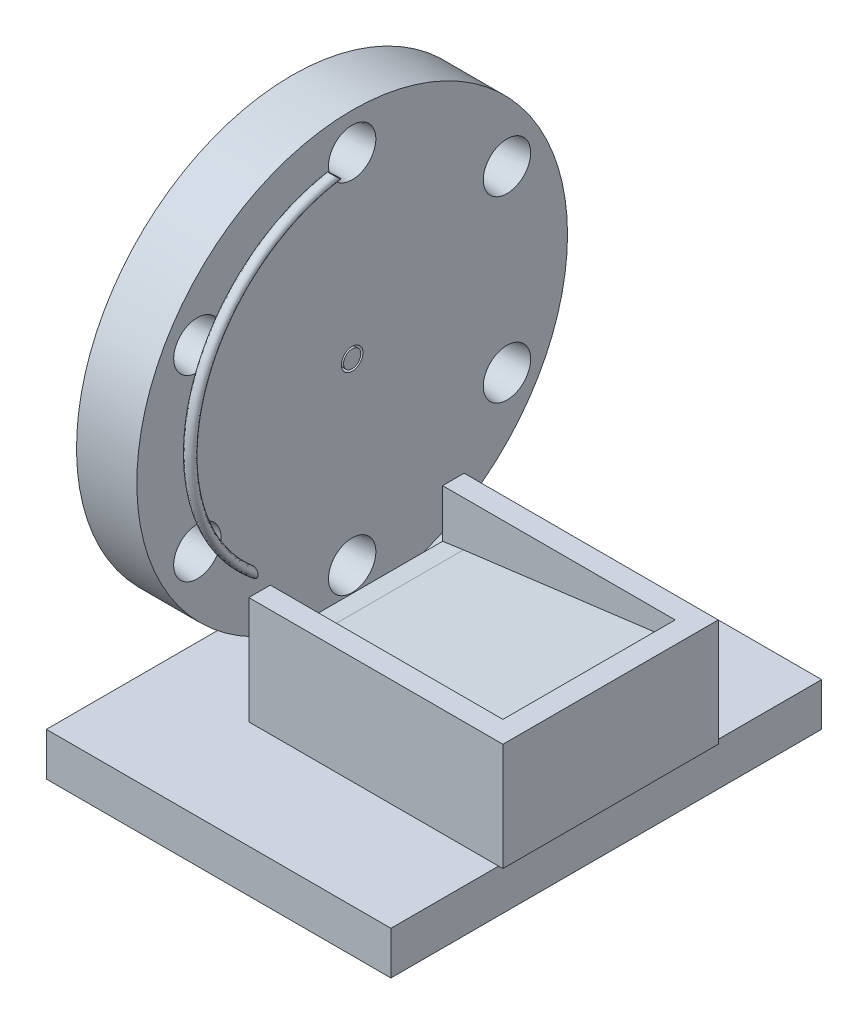
ISO-10303-21;
HEADER;
FILE_DESCRIPTION(('STEP AP214'),'2;1');
FILE_NAME('part.step','',(''),(''),'','','');
FILE_SCHEMA(('AUTOMOTIVE_DESIGN { 1 0 10303 214 1 1 1 1 }'));
ENDSEC;
DATA;
#1=APPLICATION_CONTEXT('core data for automotive mechanical design processes');
#2=APPLICATION_PROTOCOL_DEFINITION('international standard','automotive_design',2000,#1);
#3=PRODUCT_CONTEXT('',#1,'mechanical');
#4=PRODUCT('Part','Part','',(#3));
#5=PRODUCT_RELATED_PRODUCT_CATEGORY('part','',(#4));
#6=PRODUCT_DEFINITION_FORMATION('','',#4);
#7=PRODUCT_DEFINITION_CONTEXT('part definition',#1,'design');
#8=PRODUCT_DEFINITION('design','',#6,#7);
#9=PRODUCT_DEFINITION_SHAPE('','',#8);
#10=(LENGTH_UNIT() NAMED_UNIT(*) SI_UNIT(.MILLI.,.METRE.));
#11=(NAMED_UNIT(*) PLANE_ANGLE_UNIT() SI_UNIT($,.RADIAN.));
#12=(NAMED_UNIT(*) SI_UNIT($,.STERADIAN.) SOLID_ANGLE_UNIT());
#13=UNCERTAINTY_MEASURE_WITH_UNIT(LENGTH_MEASURE(1.E-05),#10,'distance_accuracy_value','');
#14=(GEOMETRIC_REPRESENTATION_CONTEXT(3) GLOBAL_UNCERTAINTY_ASSIGNED_CONTEXT((#13)) GLOBAL_UNIT_ASSIGNED_CONTEXT((#10,
#11,#12)) REPRESENTATION_CONTEXT('',''));
#15=CARTESIAN_POINT('',(0.,0.,0.));
#16=DIRECTION('',(0.,0.,1.));
#17=DIRECTION('',(1.,0.,0.));
#18=AXIS2_PLACEMENT_3D('',#15,#16,#17);
#19=CARTESIAN_POINT('',(-40.,70.,0.));
#20=DIRECTION('',(1.,0.,0.));
#21=DIRECTION('',(0.,0.,-1.));
#22=AXIS2_PLACEMENT_3D('',#19,#20,#21);
#23=CYLINDRICAL_SURFACE('',#22,2.);
#24=CARTESIAN_POINT('',(-40.,70.,0.));
#25=DIRECTION('',(1.,0.,0.));
#26=DIRECTION('',(0.,0.,-1.));
#27=AXIS2_PLACEMENT_3D('',#24,#25,#26);
#28=CIRCLE('',#27,2.);
#29=CARTESIAN_POINT('',(-40.,70.,-2.));
#30=VERTEX_POINT('',#29);
#31=EDGE_CURVE('E11',#30,#30,#28,.T.);
#32=ORIENTED_EDGE('',*,*,#31,.T.);
#33=EDGE_LOOP('',(#32));
#34=FACE_BOUND('',#33,.T.);
#35=CARTESIAN_POINT('',(-19.,70.,0.));
#36=DIRECTION('',(1.,0.,0.));
#37=DIRECTION('',(0.,0.,-1.));
#38=AXIS2_PLACEMENT_3D('',#35,#36,#37);
#39=CIRCLE('',#38,2.);
#40=CARTESIAN_POINT('',(-19.,70.,-2.));
#41=VERTEX_POINT('',#40);
#42=EDGE_CURVE('E42',#41,#41,#39,.T.);
#43=ORIENTED_EDGE('',*,*,#42,.F.);
#44=EDGE_LOOP('',(#43));
#45=FACE_BOUND('',#44,.T.);
#46=ADVANCED_FACE('F39',(#34,#45),#23,.T.);
#47=CARTESIAN_POINT('',(-40.,70.,0.));
#48=DIRECTION('',(1.,0.,0.));
#49=DIRECTION('',(0.,0.,-1.));
#50=AXIS2_PLACEMENT_3D('',#47,#48,#49);
#51=PLANE('',#50);
#52=ORIENTED_EDGE('',*,*,#31,.F.);
#53=EDGE_LOOP('',(#52));
#54=FACE_BOUND('',#53,.T.);
#55=ADVANCED_FACE('F54',(#54),#51,.F.);
#56=CARTESIAN_POINT('',(-19.,70.,0.));
#57=DIRECTION('',(1.,0.,0.));
#58=DIRECTION('',(0.,0.,-1.));
#59=AXIS2_PLACEMENT_3D('',#56,#57,#58);
#60=PLANE('',#59);
#61=ORIENTED_EDGE('',*,*,#42,.T.);
#62=EDGE_LOOP('',(#61));
#63=FACE_BOUND('',#62,.T.);
#64=ADVANCED_FACE('F51',(#63),#60,.T.);
#65=CLOSED_SHELL('',(#46,#55,#64));
#66=MANIFOLD_SOLID_BREP('B2',#65);
#67=CARTESIAN_POINT('',(-19.,70.,0.));
#68=DIRECTION('',(1.,0.,0.));
#69=DIRECTION('',(0.,0.,-1.));
#70=AXIS2_PLACEMENT_3D('',#67,#68,#69);
#71=PLANE('',#70);
#72=CARTESIAN_POINT('',(-19.,28.5,0.));
#73=DIRECTION('',(-1.,0.,0.));
#74=DIRECTION('',(0.,0.,1.));
#75=AXIS2_PLACEMENT_3D('',#72,#73,#74);
#76=CIRCLE('',#75,5.5);
#77=CARTESIAN_POINT('',(-19.,28.5,5.5));
#78=VERTEX_POINT('',#77);
#79=EDGE_CURVE('E106',#78,#78,#76,.T.);
#80=ORIENTED_EDGE('',*,*,#79,.T.);
#81=EDGE_LOOP('',(#80));
#82=FACE_BOUND('',#81,.T.);
#83=CARTESIAN_POINT('',(-19.,70.,0.));
#84=DIRECTION('',(1.,0.,0.));
#85=DIRECTION('',(0.,0.,-1.));
#86=AXIS2_PLACEMENT_3D('',#83,#84,#85);
#87=CIRCLE('',#86,50.);
#88=CARTESIAN_POINT('',(-19.,70.,-50.));
#89=VERTEX_POINT('',#88);
#90=EDGE_CURVE('E144',#89,#89,#87,.T.);
#91=ORIENTED_EDGE('',*,*,#90,.T.);
#92=EDGE_LOOP('',(#91));
#93=FACE_BOUND('',#92,.T.);
#94=CARTESIAN_POINT('',(-19.,70.,0.));
#95=DIRECTION('',(1.,0.,0.));
#96=DIRECTION('',(0.,0.,-1.));
#97=AXIS2_PLACEMENT_3D('',#94,#95,#96);
#98=CIRCLE('',#97,2.5);
#99=CARTESIAN_POINT('',(-19.,70.,-2.5));
#100=VERTEX_POINT('',#99);
#101=EDGE_CURVE('E134',#100,#100,#98,.T.);
#102=ORIENTED_EDGE('',*,*,#101,.F.);
#103=EDGE_LOOP('',(#102));
#104=FACE_BOUND('',#103,.T.);
#105=CARTESIAN_POINT('',(-19.,49.2499999999996,35.940054257054));
#106=DIRECTION('',(-1.,0.,0.));
#107=DIRECTION('',(0.,0.866025403784433,0.50000000000001));
#108=AXIS2_PLACEMENT_3D('',#105,#106,#107);
#109=CIRCLE('',#108,5.5);
#110=CARTESIAN_POINT('',(-19.,54.013139720814,38.690054257054));
#111=VERTEX_POINT('',#110);
#112=EDGE_CURVE('E129',#111,#111,#109,.T.);
#113=ORIENTED_EDGE('',*,*,#112,.T.);
#114=EDGE_LOOP('',(#113));
#115=FACE_BOUND('',#114,.T.);
#116=CARTESIAN_POINT('',(-19.,90.7499999999997,35.9400542570544));
#117=DIRECTION('',(-1.,0.,0.));
#118=DIRECTION('',(0.,0.866025403784443,-0.499999999999992));
#119=AXIS2_PLACEMENT_3D('',#116,#117,#118);
#120=CIRCLE('',#119,5.5);
#121=CARTESIAN_POINT('',(-19.,95.5131397208141,33.1900542570544));
#122=VERTEX_POINT('',#121);
#123=EDGE_CURVE('E124',#122,#122,#120,.T.);
#124=ORIENTED_EDGE('',*,*,#123,.T.);
#125=EDGE_LOOP('',(#124));
#126=FACE_BOUND('',#125,.T.);
#127=CARTESIAN_POINT('',(-19.,111.5,0.));
#128=DIRECTION('',(-1.,0.,0.));
#129=DIRECTION('',(0.,0.,-1.));
#130=AXIS2_PLACEMENT_3D('',#127,#128,#129);
#131=CIRCLE('',#130,5.5);
#132=CARTESIAN_POINT('',(-19.,111.5,-5.5));
#133=VERTEX_POINT('',#132);
#134=EDGE_CURVE('E118',#133,#133,#131,.T.);
#135=ORIENTED_EDGE('',*,*,#134,.T.);
#136=EDGE_LOOP('',(#135));
#137=FACE_BOUND('',#136,.T.);
#138=CARTESIAN_POINT('',(-19.,90.7500000000002,-35.9400542570541));
#139=DIRECTION('',(-1.,0.,0.));
#140=DIRECTION('',(0.,-0.866025403784436,-0.500000000000004));
#141=AXIS2_PLACEMENT_3D('',#138,#139,#140);
#142=CIRCLE('',#141,5.5);
#143=CARTESIAN_POINT('',(-19.,85.9868602791858,-38.6900542570541));
#144=VERTEX_POINT('',#143);
#145=EDGE_CURVE('E112',#144,#144,#142,.T.);
#146=ORIENTED_EDGE('',*,*,#145,.T.);
#147=EDGE_LOOP('',(#146));
#148=FACE_BOUND('',#147,.T.);
#149=CARTESIAN_POINT('',(-19.,49.2500000000001,-35.9400542570542));
#150=DIRECTION('',(-1.,0.,0.));
#151=DIRECTION('',(0.,-0.86602540378444,0.499999999999998));
#152=AXIS2_PLACEMENT_3D('',#149,#150,#151);
#153=CIRCLE('',#152,5.5);
#154=CARTESIAN_POINT('',(-19.,44.4868602791857,-33.1900542570543));
#155=VERTEX_POINT('',#154);
#156=EDGE_CURVE('E108',#155,#155,#153,.T.);
#157=ORIENTED_EDGE('',*,*,#156,.T.);
#158=EDGE_LOOP('',(#157));
#159=FACE_BOUND('',#158,.T.);
#160=ADVANCED_FACE('F89',(#82,#93,#104,#115,#126,#137,#148,#159),#71,.T.);
#161=CARTESIAN_POINT('',(10.,70.,0.));
#162=DIRECTION('',(-1.,0.,0.));
#163=DIRECTION('',(0.,0.,1.));
#164=AXIS2_PLACEMENT_3D('',#161,#162,#163);
#165=CYLINDRICAL_SURFACE('',#164,2.5);
#166=CARTESIAN_POINT('',(-33.,70.,0.));
#167=DIRECTION('',(1.,0.,0.));
#168=DIRECTION('',(0.,1.,0.));
#169=AXIS2_PLACEMENT_3D('',#166,#167,#168);
#170=CIRCLE('',#169,2.5);
#171=CARTESIAN_POINT('',(-33.,72.5,0.));
#172=VERTEX_POINT('',#171);
#173=EDGE_CURVE('E93',#172,#172,#170,.F.);
#174=ORIENTED_EDGE('',*,*,#173,.T.);
#175=EDGE_LOOP('',(#174));
#176=FACE_BOUND('',#175,.T.);
#177=ORIENTED_EDGE('',*,*,#101,.T.);
#178=EDGE_LOOP('',(#177));
#179=FACE_BOUND('',#178,.T.);
#180=ADVANCED_FACE('F91',(#176,#179),#165,.F.);
#181=CARTESIAN_POINT('',(-19.,70.,0.));
#182=DIRECTION('',(-1.,0.,0.));
#183=DIRECTION('',(0.,0.,1.));
#184=AXIS2_PLACEMENT_3D('',#181,#182,#183);
#185=CYLINDRICAL_SURFACE('',#184,50.);
#186=CARTESIAN_POINT('',(-33.,70.,0.));
#187=DIRECTION('',(1.,0.,0.));
#188=DIRECTION('',(0.,1.,0.));
#189=AXIS2_PLACEMENT_3D('',#186,#187,#188);
#190=CIRCLE('',#189,50.);
#191=CARTESIAN_POINT('',(-33.,120.,0.));
#192=VERTEX_POINT('',#191);
#193=EDGE_CURVE('E133',#192,#192,#190,.T.);
#194=ORIENTED_EDGE('',*,*,#193,.T.);
#195=EDGE_LOOP('',(#194));
#196=FACE_BOUND('',#195,.T.);
#197=ORIENTED_EDGE('',*,*,#90,.F.);
#198=EDGE_LOOP('',(#197));
#199=FACE_BOUND('',#198,.T.);
#200=ADVANCED_FACE('F152',(#196,#199),#185,.T.);
#201=CARTESIAN_POINT('',(-31.5,49.2500000000001,-35.9400542570542));
#202=DIRECTION('',(1.,0.,0.));
#203=DIRECTION('',(0.,0.86602540378444,-0.499999999999998));
#204=AXIS2_PLACEMENT_3D('',#201,#202,#203);
#205=CONICAL_SURFACE('',#204,4.,0.119428926018338);
#206=ORIENTED_EDGE('',*,*,#156,.F.);
#207=EDGE_LOOP('',(#206));
#208=FACE_BOUND('',#207,.T.);
#209=CARTESIAN_POINT('',(-31.5,49.2500000000001,-35.9400542570542));
#210=DIRECTION('',(-1.,0.,0.));
#211=DIRECTION('',(0.,-0.86602540378444,0.499999999999998));
#212=AXIS2_PLACEMENT_3D('',#209,#210,#211);
#213=CIRCLE('',#212,4.);
#214=CARTESIAN_POINT('',(-31.5,45.7858983848623,-33.9400542570543));
#215=VERTEX_POINT('',#214);
#216=EDGE_CURVE('E111',#215,#215,#213,.T.);
#217=ORIENTED_EDGE('',*,*,#216,.T.);
#218=EDGE_LOOP('',(#217));
#219=FACE_BOUND('',#218,.T.);
#220=ADVANCED_FACE('F154',(#208,#219),#205,.F.);
#221=CARTESIAN_POINT('',(-31.5,47.2500000000001,-39.404155872192));
#222=DIRECTION('',(-1.,0.,0.));
#223=DIRECTION('',(0.,-0.86602540378444,0.499999999999998));
#224=AXIS2_PLACEMENT_3D('',#221,#222,#223);
#225=PLANE('',#224);
#226=ORIENTED_EDGE('',*,*,#216,.F.);
#227=EDGE_LOOP('',(#226));
#228=FACE_BOUND('',#227,.T.);
#229=ADVANCED_FACE('F161',(#228),#225,.F.);
#230=CARTESIAN_POINT('',(-31.5,90.7500000000002,-35.9400542570541));
#231=DIRECTION('',(1.,0.,0.));
#232=DIRECTION('',(0.,0.866025403784436,0.500000000000004));
#233=AXIS2_PLACEMENT_3D('',#230,#231,#232);
#234=CONICAL_SURFACE('',#233,4.,0.119428926018338);
#235=ORIENTED_EDGE('',*,*,#145,.F.);
#236=EDGE_LOOP('',(#235));
#237=FACE_BOUND('',#236,.T.);
#238=CARTESIAN_POINT('',(-31.5,90.7500000000002,-35.9400542570541));
#239=DIRECTION('',(-1.,0.,0.));
#240=DIRECTION('',(0.,-0.866025403784436,-0.500000000000004));
#241=AXIS2_PLACEMENT_3D('',#238,#239,#240);
#242=CIRCLE('',#241,4.);
#243=CARTESIAN_POINT('',(-31.5,87.2858983848624,-37.9400542570541));
#244=VERTEX_POINT('',#243);
#245=EDGE_CURVE('E115',#244,#244,#242,.T.);
#246=ORIENTED_EDGE('',*,*,#245,.T.);
#247=EDGE_LOOP('',(#246));
#248=FACE_BOUND('',#247,.T.);
#249=ADVANCED_FACE('F181',(#237,#248),#234,.F.);
#250=CARTESIAN_POINT('',(-31.5,92.7500000000002,-39.4041558721919));
#251=DIRECTION('',(-1.,0.,0.));
#252=DIRECTION('',(0.,-0.866025403784436,-0.500000000000004));
#253=AXIS2_PLACEMENT_3D('',#250,#251,#252);
#254=PLANE('',#253);
#255=ORIENTED_EDGE('',*,*,#245,.F.);
#256=EDGE_LOOP('',(#255));
#257=FACE_BOUND('',#256,.T.);
#258=ADVANCED_FACE('F185',(#257),#254,.F.);
#259=CARTESIAN_POINT('',(-31.5,111.5,0.));
#260=DIRECTION('',(1.,0.,0.));
#261=DIRECTION('',(0.,0.,1.));
#262=AXIS2_PLACEMENT_3D('',#259,#260,#261);
#263=CONICAL_SURFACE('',#262,4.,0.119428926018338);
#264=ORIENTED_EDGE('',*,*,#134,.F.);
#265=EDGE_LOOP('',(#264));
#266=FACE_BOUND('',#265,.T.);
#267=CARTESIAN_POINT('',(-31.5,111.5,0.));
#268=DIRECTION('',(-1.,0.,0.));
#269=DIRECTION('',(0.,0.,-1.));
#270=AXIS2_PLACEMENT_3D('',#267,#268,#269);
#271=CIRCLE('',#270,4.);
#272=CARTESIAN_POINT('',(-31.5,111.5,-4.));
#273=VERTEX_POINT('',#272);
#274=EDGE_CURVE('E121',#273,#273,#271,.T.);
#275=ORIENTED_EDGE('',*,*,#274,.T.);
#276=EDGE_LOOP('',(#275));
#277=FACE_BOUND('',#276,.T.);
#278=ADVANCED_FACE('F189',(#266,#277),#263,.F.);
#279=CARTESIAN_POINT('',(-31.5,115.5,0.));
#280=DIRECTION('',(-1.,0.,0.));
#281=DIRECTION('',(0.,0.,-1.));
#282=AXIS2_PLACEMENT_3D('',#279,#280,#281);
#283=PLANE('',#282);
#284=ORIENTED_EDGE('',*,*,#274,.F.);
#285=EDGE_LOOP('',(#284));
#286=FACE_BOUND('',#285,.T.);
#287=ADVANCED_FACE('F193',(#286),#283,.F.);
#288=CARTESIAN_POINT('',(-31.5,90.7499999999997,35.9400542570544));
#289=DIRECTION('',(1.,0.,0.));
#290=DIRECTION('',(0.,-0.866025403784443,0.499999999999992));
#291=AXIS2_PLACEMENT_3D('',#288,#289,#290);
#292=CONICAL_SURFACE('',#291,4.,0.119428926018338);
#293=ORIENTED_EDGE('',*,*,#123,.F.);
#294=EDGE_LOOP('',(#293));
#295=FACE_BOUND('',#294,.T.);
#296=CARTESIAN_POINT('',(-31.5,90.7499999999997,35.9400542570544));
#297=DIRECTION('',(-1.,0.,0.));
#298=DIRECTION('',(0.,0.866025403784443,-0.499999999999992));
#299=AXIS2_PLACEMENT_3D('',#296,#297,#298);
#300=CIRCLE('',#299,4.);
#301=CARTESIAN_POINT('',(-31.5,94.2141016151374,33.9400542570544));
#302=VERTEX_POINT('',#301);
#303=EDGE_CURVE('E102',#302,#302,#300,.T.);
#304=ORIENTED_EDGE('',*,*,#303,.T.);
#305=EDGE_LOOP('',(#304));
#306=FACE_BOUND('',#305,.T.);
#307=ADVANCED_FACE('F197',(#295,#306),#292,.F.);
#308=CARTESIAN_POINT('',(-31.5,92.7499999999996,39.4041558721922));
#309=DIRECTION('',(-1.,0.,0.));
#310=DIRECTION('',(0.,0.866025403784443,-0.499999999999992));
#311=AXIS2_PLACEMENT_3D('',#308,#309,#310);
#312=PLANE('',#311);
#313=ORIENTED_EDGE('',*,*,#303,.F.);
#314=EDGE_LOOP('',(#313));
#315=FACE_BOUND('',#314,.T.);
#316=ADVANCED_FACE('F201',(#315),#312,.F.);
#317=CARTESIAN_POINT('',(-31.5,49.2499999999996,35.940054257054));
#318=DIRECTION('',(1.,0.,0.));
#319=DIRECTION('',(0.,-0.866025403784433,-0.50000000000001));
#320=AXIS2_PLACEMENT_3D('',#317,#318,#319);
#321=CONICAL_SURFACE('',#320,4.,0.119428926018338);
#322=ORIENTED_EDGE('',*,*,#112,.F.);
#323=EDGE_LOOP('',(#322));
#324=FACE_BOUND('',#323,.T.);
#325=CARTESIAN_POINT('',(-31.5,49.2499999999996,35.940054257054));
#326=DIRECTION('',(-1.,0.,0.));
#327=DIRECTION('',(0.,0.866025403784433,0.50000000000001));
#328=AXIS2_PLACEMENT_3D('',#325,#326,#327);
#329=CIRCLE('',#328,4.);
#330=CARTESIAN_POINT('',(-31.5,52.7141016151373,37.940054257054));
#331=VERTEX_POINT('',#330);
#332=EDGE_CURVE('E97',#331,#331,#329,.T.);
#333=ORIENTED_EDGE('',*,*,#332,.T.);
#334=EDGE_LOOP('',(#333));
#335=FACE_BOUND('',#334,.T.);
#336=ADVANCED_FACE('F205',(#324,#335),#321,.F.);
#337=CARTESIAN_POINT('',(-31.5,47.2499999999995,39.4041558721917));
#338=DIRECTION('',(-1.,0.,0.));
#339=DIRECTION('',(0.,0.866025403784433,0.50000000000001));
#340=AXIS2_PLACEMENT_3D('',#337,#338,#339);
#341=PLANE('',#340);
#342=ORIENTED_EDGE('',*,*,#332,.F.);
#343=EDGE_LOOP('',(#342));
#344=FACE_BOUND('',#343,.T.);
#345=ADVANCED_FACE('F176',(#344),#341,.F.);
#346=CARTESIAN_POINT('',(-31.5,24.5,0.));
#347=DIRECTION('',(-1.,0.,0.));
#348=DIRECTION('',(0.,0.,1.));
#349=AXIS2_PLACEMENT_3D('',#346,#347,#348);
#350=PLANE('',#349);
#351=CARTESIAN_POINT('',(-31.5,28.5,0.));
#352=DIRECTION('',(-1.,0.,0.));
#353=DIRECTION('',(0.,0.,1.));
#354=AXIS2_PLACEMENT_3D('',#351,#352,#353);
#355=CIRCLE('',#354,4.);
#356=CARTESIAN_POINT('',(-31.5,28.5,4.));
#357=VERTEX_POINT('',#356);
#358=EDGE_CURVE('E38',#357,#357,#355,.T.);
#359=ORIENTED_EDGE('',*,*,#358,.F.);
#360=EDGE_LOOP('',(#359));
#361=FACE_BOUND('',#360,.T.);
#362=ADVANCED_FACE('F173',(#361),#350,.F.);
#363=CARTESIAN_POINT('',(-31.5,28.5,0.));
#364=DIRECTION('',(1.,0.,0.));
#365=DIRECTION('',(0.,0.,-1.));
#366=AXIS2_PLACEMENT_3D('',#363,#364,#365);
#367=CONICAL_SURFACE('',#366,4.,0.119428926018338);
#368=ORIENTED_EDGE('',*,*,#79,.F.);
#369=EDGE_LOOP('',(#368));
#370=FACE_BOUND('',#369,.T.);
#371=ORIENTED_EDGE('',*,*,#358,.T.);
#372=EDGE_LOOP('',(#371));
#373=FACE_BOUND('',#372,.T.);
#374=ADVANCED_FACE('F169',(#370,#373),#367,.F.);
#375=CARTESIAN_POINT('',(-33.,123.685882858653,-75.));
#376=DIRECTION('',(1.,0.,0.));
#377=DIRECTION('',(0.,1.,0.));
#378=AXIS2_PLACEMENT_3D('',#375,#376,#377);
#379=PLANE('',#378);
#380=ORIENTED_EDGE('',*,*,#193,.F.);
#381=EDGE_LOOP('',(#380));
#382=FACE_BOUND('',#381,.T.);
#383=ORIENTED_EDGE('',*,*,#173,.F.);
#384=EDGE_LOOP('',(#383));
#385=FACE_BOUND('',#384,.T.);
#386=ADVANCED_FACE('F172',(#382,#385),#379,.F.);
#387=CLOSED_SHELL('',(#160,#180,#200,#220,#229,#249,#258,#278,#287,#307,#316,#336,#345,#362,
#374,#386));
#388=MANIFOLD_SOLID_BREP('B6',#387);
#389=CARTESIAN_POINT('',(-16.5,41.2136908193255,25.5746401084224));
#390=DIRECTION('',(0.,0.,1.));
#391=DIRECTION('',(1.,0.,0.));
#392=AXIS2_PLACEMENT_3D('',#389,#390,#391);
#393=PLANE('',#392);
#394=CARTESIAN_POINT('',(-16.5,41.2136908193255,25.5746401084224));
#395=DIRECTION('',(0.,0.,1.));
#396=DIRECTION('',(1.,0.,0.));
#397=AXIS2_PLACEMENT_3D('',#394,#395,#396);
#398=CIRCLE('',#397,1.25);
#399=CARTESIAN_POINT('',(-15.25,41.2136908193255,25.5746401084224));
#400=VERTEX_POINT('',#399);
#401=EDGE_CURVE('E355',#400,#400,#398,.T.);
#402=ORIENTED_EDGE('',*,*,#401,.F.);
#403=EDGE_LOOP('',(#402));
#404=FACE_BOUND('',#403,.T.);
#405=ADVANCED_FACE('F348',(#404),#393,.F.);
#406=CARTESIAN_POINT('',(-16.5,111.46091657168,6.64276366452526));
#407=DIRECTION('',(0.,0.754706316294018,-0.656062783692166));
#408=DIRECTION('',(1.,0.,0.));
#409=AXIS2_PLACEMENT_3D('',#406,#407,#408);
#410=PLANE('',#409);
#411=CARTESIAN_POINT('',(-16.5,111.46091657168,6.64276366452526));
#412=DIRECTION('',(0.,0.754706316294018,-0.656062783692166));
#413=DIRECTION('',(1.,0.,0.));
#414=AXIS2_PLACEMENT_3D('',#411,#412,#413);
#415=CIRCLE('',#414,1.25);
#416=CARTESIAN_POINT('',(-15.25,111.46091657168,6.64276366452526));
#417=VERTEX_POINT('',#416);
#418=EDGE_CURVE('E87',#417,#417,#415,.T.);
#419=ORIENTED_EDGE('',*,*,#418,.T.);
#420=EDGE_LOOP('',(#419));
#421=FACE_BOUND('',#420,.T.);
#422=ADVANCED_FACE('F362',(#421),#410,.T.);
#423=CARTESIAN_POINT('',(-15.25,41.2136908193255,25.5746401084224));
#424=CARTESIAN_POINT('',(-15.25,66.5545905132939,56.225127642911));
#425=CARTESIAN_POINT('',(-15.25,104.9540212264,45.876344897535));
#426=CARTESIAN_POINT('',(-15.25,111.460916571681,6.64276366452528));
#427=CARTESIAN_POINT('',(-15.25,43.7136908193255,25.5746401084224));
#428=CARTESIAN_POINT('',(-15.25,69.0545905132939,53.7380518894193));
#429=CARTESIAN_POINT('',(-15.25,105.190876047431,42.3579012647109));
#430=CARTESIAN_POINT('',(-15.25,109.82075961245,4.75599787379023));
#431=CARTESIAN_POINT('',(-17.75,43.7136908193255,25.5746401084224));
#432=CARTESIAN_POINT('',(-17.75,69.0545905132939,53.7380518894193));
#433=CARTESIAN_POINT('',(-17.75,105.190876047431,42.3579012647109));
#434=CARTESIAN_POINT('',(-17.75,109.82075961245,4.75599787379023));
#435=CARTESIAN_POINT('',(-17.75,41.2136908193255,25.5746401084224));
#436=CARTESIAN_POINT('',(-17.75,66.5545905132939,56.225127642911));
#437=CARTESIAN_POINT('',(-17.75,104.9540212264,45.876344897535));
#438=CARTESIAN_POINT('',(-17.75,111.460916571681,6.64276366452528));
#439=CARTESIAN_POINT('',(-17.75,38.7136908193255,25.5746401084224));
#440=CARTESIAN_POINT('',(-17.75,64.0545905132939,58.7122033964028));
#441=CARTESIAN_POINT('',(-17.75,104.717166405368,49.3947885303592));
#442=CARTESIAN_POINT('',(-17.75,113.101073530911,8.52952945526031));
#443=CARTESIAN_POINT('',(-15.25,38.7136908193255,25.5746401084224));
#444=CARTESIAN_POINT('',(-15.25,64.0545905132939,58.7122033964028));
#445=CARTESIAN_POINT('',(-15.25,104.717166405368,49.3947885303592));
#446=CARTESIAN_POINT('',(-15.25,113.101073530911,8.52952945526031));
#447=CARTESIAN_POINT('',(-15.25,41.2136908193255,25.5746401084224));
#448=CARTESIAN_POINT('',(-15.25,66.5545905132939,56.225127642911));
#449=CARTESIAN_POINT('',(-15.25,104.9540212264,45.876344897535));
#450=CARTESIAN_POINT('',(-15.25,111.460916571681,6.64276366452528));
#451=(BOUNDED_SURFACE() B_SPLINE_SURFACE(3,3,((#423,#424,#425,#426),(#427,#428,#429,#430),(#431,
#432,#433,#434),(#435,#436,#437,#438),(#439,#440,#441,#442),(#443,#444,#445,#446),(#447,#448,
#449,#450)),.UNSPECIFIED.,.T.,.F.,.F.) B_SPLINE_SURFACE_WITH_KNOTS((4,3,4),(4,4),(0.,0.5,1.),
(0.,1.),.UNSPECIFIED.) GEOMETRIC_REPRESENTATION_ITEM() RATIONAL_B_SPLINE_SURFACE(((1.,
0.609793986072294,0.609793986072294,1.),(0.333333333333333,0.203264662024098,0.203264662024098,
0.333333333333333),(0.333333333333333,0.203264662024098,0.203264662024098,0.333333333333333),
(1.,0.609793986072294,0.609793986072294,1.),(0.333333333333333,0.203264662024098,
0.203264662024098,0.333333333333333),(0.333333333333333,0.203264662024098,0.203264662024098,
0.333333333333333),(1.,0.609793986072294,0.609793986072294,1.))) REPRESENTATION_ITEM('') SURFACE());
#452=ORIENTED_EDGE('',*,*,#418,.F.);
#453=EDGE_LOOP('',(#452));
#454=FACE_BOUND('',#453,.T.);
#455=ORIENTED_EDGE('',*,*,#401,.T.);
#456=EDGE_LOOP('',(#455));
#457=FACE_BOUND('',#456,.T.);
#458=ADVANCED_FACE('F364',(#454,#457),#451,.T.);
#459=CLOSED_SHELL('',(#405,#422,#458));
#460=MANIFOLD_SOLID_BREP('B33',#459);
#461=CARTESIAN_POINT('',(-22.6862915010152,70.,0.));
#462=DIRECTION('',(-1.,0.,0.));
#463=DIRECTION('',(0.,0.,1.));
#464=AXIS2_PLACEMENT_3D('',#461,#462,#463);
#465=CYLINDRICAL_SURFACE('',#464,4.);
#466=CARTESIAN_POINT('',(-34.,70.,0.));
#467=DIRECTION('',(-1.,0.,0.));
#468=DIRECTION('',(0.,0.,1.));
#469=AXIS2_PLACEMENT_3D('',#466,#467,#468);
#470=CIRCLE('',#469,4.);
#471=CARTESIAN_POINT('',(-34.,70.,-4.));
#472=VERTEX_POINT('',#471);
#473=CARTESIAN_POINT('',(-34.,70.,4.));
#474=VERTEX_POINT('',#473);
#475=EDGE_CURVE('E591',#472,#474,#470,.F.);
#476=ORIENTED_EDGE('',*,*,#475,.F.);
#477=DIRECTION('',(-1.,0.,0.));
#478=VECTOR('',#477,1.);
#479=CARTESIAN_POINT('',(-40.,70.,-4.));
#480=LINE('',#479,#478);
#481=CARTESIAN_POINT('',(-40.,70.,-4.));
#482=VERTEX_POINT('',#481);
#483=EDGE_CURVE('E597',#472,#482,#480,.T.);
#484=ORIENTED_EDGE('',*,*,#483,.T.);
#485=CARTESIAN_POINT('',(-40.,70.,0.));
#486=DIRECTION('',(-1.,0.,0.));
#487=DIRECTION('',(0.,0.,1.));
#488=AXIS2_PLACEMENT_3D('',#485,#486,#487);
#489=CIRCLE('',#488,4.);
#490=CARTESIAN_POINT('',(-40.,70.,4.));
#491=VERTEX_POINT('',#490);
#492=EDGE_CURVE('E588',#491,#482,#489,.T.);
#493=ORIENTED_EDGE('',*,*,#492,.F.);
#494=DIRECTION('',(1.,0.,0.));
#495=VECTOR('',#494,1.);
#496=CARTESIAN_POINT('',(-40.,70.,4.));
#497=LINE('',#496,#495);
#498=EDGE_CURVE('E594',#491,#474,#497,.T.);
#499=ORIENTED_EDGE('',*,*,#498,.T.);
#500=EDGE_LOOP('',(#476,#484,#493,#499));
#501=FACE_BOUND('',#500,.T.);
#502=ADVANCED_FACE('F397',(#501),#465,.T.);
#503=CARTESIAN_POINT('',(10.,70.,0.));
#504=DIRECTION('',(-1.,0.,0.));
#505=DIRECTION('',(0.,0.,1.));
#506=AXIS2_PLACEMENT_3D('',#503,#504,#505);
#507=CYLINDRICAL_SURFACE('',#506,2.5);
#508=CARTESIAN_POINT('',(-34.,70.,0.));
#509=DIRECTION('',(-1.,0.,0.));
#510=DIRECTION('',(0.,0.,1.));
#511=AXIS2_PLACEMENT_3D('',#508,#509,#510);
#512=CIRCLE('',#511,2.5);
#513=CARTESIAN_POINT('',(-34.,70.,2.5));
#514=VERTEX_POINT('',#513);
#515=EDGE_CURVE('E547',#514,#514,#512,.F.);
#516=ORIENTED_EDGE('',*,*,#515,.T.);
#517=EDGE_LOOP('',(#516));
#518=FACE_BOUND('',#517,.T.);
#519=CARTESIAN_POINT('',(-40.,70.,0.));
#520=DIRECTION('',(-1.,0.,0.));
#521=DIRECTION('',(0.,0.,1.));
#522=AXIS2_PLACEMENT_3D('',#519,#520,#521);
#523=CIRCLE('',#522,2.5);
#524=CARTESIAN_POINT('',(-40.,70.,2.5));
#525=VERTEX_POINT('',#524);
#526=EDGE_CURVE('E585',#525,#525,#523,.T.);
#527=ORIENTED_EDGE('',*,*,#526,.T.);
#528=EDGE_LOOP('',(#527));
#529=FACE_BOUND('',#528,.T.);
#530=ADVANCED_FACE('F739',(#518,#529),#507,.F.);
#531=CARTESIAN_POINT('',(40.,10.,50.));
#532=DIRECTION('',(-1.,0.,0.));
#533=DIRECTION('',(0.,0.,1.));
#534=AXIS2_PLACEMENT_3D('',#531,#532,#533);
#535=PLANE('',#534);
#536=DIRECTION('',(0.,0.,-1.));
#537=VECTOR('',#536,1.);
#538=CARTESIAN_POINT('',(40.,0.,50.));
#539=LINE('',#538,#537);
#540=CARTESIAN_POINT('',(40.,0.,50.));
#541=VERTEX_POINT('',#540);
#542=CARTESIAN_POINT('',(40.,0.,-50.));
#543=VERTEX_POINT('',#542);
#544=EDGE_CURVE('E636',#541,#543,#539,.T.);
#545=ORIENTED_EDGE('',*,*,#544,.T.);
#546=DIRECTION('',(0.,-1.,0.));
#547=VECTOR('',#546,1.);
#548=CARTESIAN_POINT('',(40.,10.,-50.));
#549=LINE('',#548,#547);
#550=CARTESIAN_POINT('',(40.,10.,-50.));
#551=VERTEX_POINT('',#550);
#552=EDGE_CURVE('E642',#551,#543,#549,.T.);
#553=ORIENTED_EDGE('',*,*,#552,.F.);
#554=DIRECTION('',(0.,0.,-1.));
#555=VECTOR('',#554,1.);
#556=CARTESIAN_POINT('',(40.,10.,50.));
#557=LINE('',#556,#555);
#558=CARTESIAN_POINT('',(40.,10.,-25.));
#559=VERTEX_POINT('',#558);
#560=EDGE_CURVE('E624',#559,#551,#557,.T.);
#561=ORIENTED_EDGE('',*,*,#560,.F.);
#562=CARTESIAN_POINT('',(40.,10.,25.));
#563=VERTEX_POINT('',#562);
#564=EDGE_CURVE('E629',#563,#559,#557,.T.);
#565=ORIENTED_EDGE('',*,*,#564,.F.);
#566=CARTESIAN_POINT('',(40.,10.,50.));
#567=VERTEX_POINT('',#566);
#568=EDGE_CURVE('E625',#567,#563,#557,.T.);
#569=ORIENTED_EDGE('',*,*,#568,.F.);
#570=DIRECTION('',(0.,-1.,0.));
#571=VECTOR('',#570,1.);
#572=CARTESIAN_POINT('',(40.,10.,50.));
#573=LINE('',#572,#571);
#574=EDGE_CURVE('E645',#567,#541,#573,.T.);
#575=ORIENTED_EDGE('',*,*,#574,.T.);
#576=EDGE_LOOP('',(#545,#553,#561,#565,#569,#575));
#577=FACE_BOUND('',#576,.T.);
#578=ADVANCED_FACE('F667',(#577),#535,.F.);
#579=CARTESIAN_POINT('',(0.,0.,0.));
#580=DIRECTION('',(0.,1.,0.));
#581=DIRECTION('',(0.,0.,1.));
#582=AXIS2_PLACEMENT_3D('',#579,#580,#581);
#583=PLANE('',#582);
#584=DIRECTION('',(0.,0.,1.));
#585=VECTOR('',#584,1.);
#586=CARTESIAN_POINT('',(-40.,0.,50.));
#587=LINE('',#586,#585);
#588=CARTESIAN_POINT('',(-40.,0.,-50.));
#589=VERTEX_POINT('',#588);
#590=CARTESIAN_POINT('',(-40.,0.,50.));
#591=VERTEX_POINT('',#590);
#592=EDGE_CURVE('E618',#589,#591,#587,.T.);
#593=ORIENTED_EDGE('',*,*,#592,.F.);
#594=DIRECTION('',(-1.,0.,0.));
#595=VECTOR('',#594,1.);
#596=CARTESIAN_POINT('',(40.,0.,-50.));
#597=LINE('',#596,#595);
#598=EDGE_CURVE('E638',#543,#589,#597,.T.);
#599=ORIENTED_EDGE('',*,*,#598,.F.);
#600=ORIENTED_EDGE('',*,*,#544,.F.);
#601=DIRECTION('',(1.,0.,0.));
#602=VECTOR('',#601,1.);
#603=CARTESIAN_POINT('',(40.,0.,50.));
#604=LINE('',#603,#602);
#605=EDGE_CURVE('E634',#591,#541,#604,.T.);
#606=ORIENTED_EDGE('',*,*,#605,.F.);
#607=EDGE_LOOP('',(#593,#599,#600,#606));
#608=FACE_BOUND('',#607,.T.);
#609=ADVANCED_FACE('F663',(#608),#583,.F.);
#610=CARTESIAN_POINT('',(36.,30.8032647421328,69.5686783612047));
#611=DIRECTION('',(0.127162251456478,-0.991881929366857,0.));
#612=DIRECTION('',(0.991881929366857,0.127162251456478,0.));
#613=AXIS2_PLACEMENT_3D('',#610,#611,#612);
#614=PLANE('',#613);
#615=DIRECTION('',(-0.991881929366857,-0.127162251456478,0.));
#616=VECTOR('',#615,1.);
#617=CARTESIAN_POINT('',(36.,30.8032647421328,20.));
#618=LINE('',#617,#616);
#619=CARTESIAN_POINT('',(36.,30.8032647421328,20.));
#620=VERTEX_POINT('',#619);
#621=CARTESIAN_POINT('',(-13.166276329077,24.5,20.));
#622=VERTEX_POINT('',#621);
#623=EDGE_CURVE('E532',#620,#622,#618,.T.);
#624=ORIENTED_EDGE('',*,*,#623,.F.);
#625=DIRECTION('',(0.,0.,-1.));
#626=VECTOR('',#625,1.);
#627=CARTESIAN_POINT('',(36.,30.8032647421328,69.5686783612047));
#628=LINE('',#627,#626);
#629=CARTESIAN_POINT('',(36.,30.8032647421328,-20.));
#630=VERTEX_POINT('',#629);
#631=EDGE_CURVE('E545',#620,#630,#628,.T.);
#632=ORIENTED_EDGE('',*,*,#631,.T.);
#633=DIRECTION('',(-0.991881929366857,-0.127162251456478,0.));
#634=VECTOR('',#633,1.);
#635=CARTESIAN_POINT('',(36.,30.8032647421328,-20.));
#636=LINE('',#635,#634);
#637=CARTESIAN_POINT('',(-13.166276329077,24.5,-20.));
#638=VERTEX_POINT('',#637);
#639=EDGE_CURVE('E533',#630,#638,#636,.T.);
#640=ORIENTED_EDGE('',*,*,#639,.T.);
#641=DIRECTION('',(0.,0.,-1.));
#642=VECTOR('',#641,1.);
#643=CARTESIAN_POINT('',(-13.166276329077,24.5,69.5686783612047));
#644=LINE('',#643,#642);
#645=EDGE_CURVE('E523',#622,#638,#644,.T.);
#646=ORIENTED_EDGE('',*,*,#645,.F.);
#647=EDGE_LOOP('',(#624,#632,#640,#646));
#648=FACE_BOUND('',#647,.T.);
#649=ADVANCED_FACE('F543',(#648),#614,.F.);
#650=CARTESIAN_POINT('',(36.,24.5,-20.));
#651=DIRECTION('',(1.,0.,0.));
#652=DIRECTION('',(0.,0.,-1.));
#653=AXIS2_PLACEMENT_3D('',#650,#651,#652);
#654=PLANE('',#653);
#655=ORIENTED_EDGE('',*,*,#631,.F.);
#656=DIRECTION('',(0.,1.,0.));
#657=VECTOR('',#656,1.);
#658=CARTESIAN_POINT('',(36.,24.5,20.));
#659=LINE('',#658,#657);
#660=CARTESIAN_POINT('',(36.,35.,20.));
#661=VERTEX_POINT('',#660);
#662=EDGE_CURVE('E560',#620,#661,#659,.T.);
#663=ORIENTED_EDGE('',*,*,#662,.T.);
#664=DIRECTION('',(0.,0.,-1.));
#665=VECTOR('',#664,1.);
#666=CARTESIAN_POINT('',(36.,35.,-20.));
#667=LINE('',#666,#665);
#668=CARTESIAN_POINT('',(36.,35.,-20.));
#669=VERTEX_POINT('',#668);
#670=EDGE_CURVE('E555',#661,#669,#667,.T.);
#671=ORIENTED_EDGE('',*,*,#670,.T.);
#672=DIRECTION('',(0.,1.,0.));
#673=VECTOR('',#672,1.);
#674=CARTESIAN_POINT('',(36.,24.5,-20.));
#675=LINE('',#674,#673);
#676=EDGE_CURVE('E561',#630,#669,#675,.T.);
#677=ORIENTED_EDGE('',*,*,#676,.F.);
#678=EDGE_LOOP('',(#655,#663,#671,#677));
#679=FACE_BOUND('',#678,.T.);
#680=ADVANCED_FACE('F722',(#679),#654,.F.);
#681=CARTESIAN_POINT('',(0.,10.,0.));
#682=DIRECTION('',(0.,1.,0.));
#683=DIRECTION('',(0.,0.,1.));
#684=AXIS2_PLACEMENT_3D('',#681,#682,#683);
#685=PLANE('',#684);
#686=DIRECTION('',(1.,0.,0.));
#687=VECTOR('',#686,1.);
#688=CARTESIAN_POINT('',(40.,10.,50.));
#689=LINE('',#688,#687);
#690=CARTESIAN_POINT('',(-40.,10.,50.));
#691=VERTEX_POINT('',#690);
#692=EDGE_CURVE('E621',#691,#567,#689,.T.);
#693=ORIENTED_EDGE('',*,*,#692,.T.);
#694=ORIENTED_EDGE('',*,*,#568,.T.);
#695=DIRECTION('',(1.,0.,0.));
#696=VECTOR('',#695,1.);
#697=CARTESIAN_POINT('',(-19.,10.,25.));
#698=LINE('',#697,#696);
#699=CARTESIAN_POINT('',(-18.,10.,25.));
#700=VERTEX_POINT('',#699);
#701=EDGE_CURVE('E575',#700,#563,#698,.T.);
#702=ORIENTED_EDGE('',*,*,#701,.F.);
#703=DIRECTION('',(0.,0.,1.));
#704=VECTOR('',#703,1.);
#705=CARTESIAN_POINT('',(-18.,10.,-75.));
#706=LINE('',#705,#704);
#707=CARTESIAN_POINT('',(-18.,10.,-25.));
#708=VERTEX_POINT('',#707);
#709=EDGE_CURVE('E711',#708,#700,#706,.T.);
#710=ORIENTED_EDGE('',*,*,#709,.F.);
#711=DIRECTION('',(1.,0.,0.));
#712=VECTOR('',#711,1.);
#713=CARTESIAN_POINT('',(0.,10.,-25.));
#714=LINE('',#713,#712);
#715=EDGE_CURVE('E405',#708,#559,#714,.T.);
#716=ORIENTED_EDGE('',*,*,#715,.T.);
#717=ORIENTED_EDGE('',*,*,#560,.T.);
#718=DIRECTION('',(-1.,0.,0.));
#719=VECTOR('',#718,1.);
#720=CARTESIAN_POINT('',(40.,10.,-50.));
#721=LINE('',#720,#719);
#722=CARTESIAN_POINT('',(-40.,10.,-50.));
#723=VERTEX_POINT('',#722);
#724=EDGE_CURVE('E628',#551,#723,#721,.T.);
#725=ORIENTED_EDGE('',*,*,#724,.T.);
#726=DIRECTION('',(0.,0.,1.));
#727=VECTOR('',#726,1.);
#728=CARTESIAN_POINT('',(-40.,10.,50.));
#729=LINE('',#728,#727);
#730=CARTESIAN_POINT('',(-40.,10.,-4.));
#731=VERTEX_POINT('',#730);
#732=EDGE_CURVE('E619',#723,#731,#729,.T.);
#733=ORIENTED_EDGE('',*,*,#732,.T.);
#734=DIRECTION('',(-1.,0.,0.));
#735=VECTOR('',#734,1.);
#736=CARTESIAN_POINT('',(-40.,10.,-4.));
#737=LINE('',#736,#735);
#738=CARTESIAN_POINT('',(-34.,10.,-4.));
#739=VERTEX_POINT('',#738);
#740=EDGE_CURVE('E598',#739,#731,#737,.T.);
#741=ORIENTED_EDGE('',*,*,#740,.F.);
#742=DIRECTION('',(0.,0.,-1.));
#743=VECTOR('',#742,1.);
#744=CARTESIAN_POINT('',(-34.,10.,-4.));
#745=LINE('',#744,#743);
#746=CARTESIAN_POINT('',(-34.,10.,4.));
#747=VERTEX_POINT('',#746);
#748=EDGE_CURVE('E604',#747,#739,#745,.T.);
#749=ORIENTED_EDGE('',*,*,#748,.F.);
#750=DIRECTION('',(1.,0.,0.));
#751=VECTOR('',#750,1.);
#752=CARTESIAN_POINT('',(-40.,10.,4.));
#753=LINE('',#752,#751);
#754=CARTESIAN_POINT('',(-40.,10.,4.));
#755=VERTEX_POINT('',#754);
#756=EDGE_CURVE('E593',#755,#747,#753,.T.);
#757=ORIENTED_EDGE('',*,*,#756,.F.);
#758=EDGE_CURVE('E622',#755,#691,#729,.T.);
#759=ORIENTED_EDGE('',*,*,#758,.T.);
#760=EDGE_LOOP('',(#693,#694,#702,#710,#716,#717,#725,#733,#741,#749,#757,#759));
#761=FACE_BOUND('',#760,.T.);
#762=ADVANCED_FACE('F673',(#761),#685,.T.);
#763=CARTESIAN_POINT('',(41.,35.,-25.));
#764=DIRECTION('',(-1.,0.,0.));
#765=DIRECTION('',(0.,0.,1.));
#766=AXIS2_PLACEMENT_3D('',#763,#764,#765);
#767=PLANE('',#766);
#768=DIRECTION('',(0.,0.,-1.));
#769=VECTOR('',#768,1.);
#770=CARTESIAN_POINT('',(41.,10.,-25.));
#771=LINE('',#770,#769);
#772=CARTESIAN_POINT('',(41.,10.,25.));
#773=VERTEX_POINT('',#772);
#774=CARTESIAN_POINT('',(41.,10.,-25.));
#775=VERTEX_POINT('',#774);
#776=EDGE_CURVE('E577',#773,#775,#771,.T.);
#777=ORIENTED_EDGE('',*,*,#776,.T.);
#778=DIRECTION('',(0.,-1.,0.));
#779=VECTOR('',#778,1.);
#780=CARTESIAN_POINT('',(41.,35.,-25.));
#781=LINE('',#780,#779);
#782=CARTESIAN_POINT('',(41.,35.,-25.));
#783=VERTEX_POINT('',#782);
#784=EDGE_CURVE('E574',#783,#775,#781,.T.);
#785=ORIENTED_EDGE('',*,*,#784,.F.);
#786=DIRECTION('',(0.,0.,-1.));
#787=VECTOR('',#786,1.);
#788=CARTESIAN_POINT('',(41.,35.,-25.));
#789=LINE('',#788,#787);
#790=CARTESIAN_POINT('',(41.,35.,25.));
#791=VERTEX_POINT('',#790);
#792=EDGE_CURVE('E568',#791,#783,#789,.T.);
#793=ORIENTED_EDGE('',*,*,#792,.F.);
#794=DIRECTION('',(0.,-1.,0.));
#795=VECTOR('',#794,1.);
#796=CARTESIAN_POINT('',(41.,35.,25.));
#797=LINE('',#796,#795);
#798=EDGE_CURVE('E582',#791,#773,#797,.T.);
#799=ORIENTED_EDGE('',*,*,#798,.T.);
#800=EDGE_LOOP('',(#777,#785,#793,#799));
#801=FACE_BOUND('',#800,.T.);
#802=ADVANCED_FACE('F753',(#801),#767,.F.);
#803=CARTESIAN_POINT('',(0.,10.,0.));
#804=DIRECTION('',(0.,1.,0.));
#805=DIRECTION('',(0.,0.,1.));
#806=AXIS2_PLACEMENT_3D('',#803,#804,#805);
#807=PLANE('',#806);
#808=EDGE_CURVE('E563',#563,#773,#698,.T.);
#809=ORIENTED_EDGE('',*,*,#808,.F.);
#810=ORIENTED_EDGE('',*,*,#564,.T.);
#811=DIRECTION('',(-1.,0.,0.));
#812=VECTOR('',#811,1.);
#813=CARTESIAN_POINT('',(-19.,10.,-25.));
#814=LINE('',#813,#812);
#815=EDGE_CURVE('E569',#775,#559,#814,.T.);
#816=ORIENTED_EDGE('',*,*,#815,.F.);
#817=ORIENTED_EDGE('',*,*,#776,.F.);
#818=EDGE_LOOP('',(#809,#810,#816,#817));
#819=FACE_BOUND('',#818,.T.);
#820=ADVANCED_FACE('F680',(#819),#807,.F.);
#821=CARTESIAN_POINT('',(-19.,35.,-25.));
#822=DIRECTION('',(0.,0.,1.));
#823=DIRECTION('',(1.,0.,0.));
#824=AXIS2_PLACEMENT_3D('',#821,#822,#823);
#825=PLANE('',#824);
#826=ORIENTED_EDGE('',*,*,#715,.F.);
#827=DIRECTION('',(0.,1.,0.));
#828=VECTOR('',#827,1.);
#829=CARTESIAN_POINT('',(-18.,35.,-25.));
#830=LINE('',#829,#828);
#831=CARTESIAN_POINT('',(-18.,35.,-25.));
#832=VERTEX_POINT('',#831);
#833=EDGE_CURVE('E701',#708,#832,#830,.T.);
#834=ORIENTED_EDGE('',*,*,#833,.T.);
#835=DIRECTION('',(-1.,0.,0.));
#836=VECTOR('',#835,1.);
#837=CARTESIAN_POINT('',(-19.,35.,-25.));
#838=LINE('',#837,#836);
#839=EDGE_CURVE('E571',#783,#832,#838,.T.);
#840=ORIENTED_EDGE('',*,*,#839,.F.);
#841=ORIENTED_EDGE('',*,*,#784,.T.);
#842=ORIENTED_EDGE('',*,*,#815,.T.);
#843=EDGE_LOOP('',(#826,#834,#840,#841,#842));
#844=FACE_BOUND('',#843,.T.);
#845=ADVANCED_FACE('F865',(#844),#825,.F.);
#846=CARTESIAN_POINT('',(-19.,35.,25.));
#847=DIRECTION('',(0.,0.,-1.));
#848=DIRECTION('',(-1.,0.,0.));
#849=AXIS2_PLACEMENT_3D('',#846,#847,#848);
#850=PLANE('',#849);
#851=DIRECTION('',(1.,0.,0.));
#852=VECTOR('',#851,1.);
#853=CARTESIAN_POINT('',(-19.,35.,25.));
#854=LINE('',#853,#852);
#855=CARTESIAN_POINT('',(-18.,35.,25.));
#856=VERTEX_POINT('',#855);
#857=EDGE_CURVE('E566',#856,#791,#854,.T.);
#858=ORIENTED_EDGE('',*,*,#857,.F.);
#859=DIRECTION('',(0.,-1.,0.));
#860=VECTOR('',#859,1.);
#861=CARTESIAN_POINT('',(-18.,35.,25.));
#862=LINE('',#861,#860);
#863=EDGE_CURVE('E346',#856,#700,#862,.T.);
#864=ORIENTED_EDGE('',*,*,#863,.T.);
#865=ORIENTED_EDGE('',*,*,#701,.T.);
#866=ORIENTED_EDGE('',*,*,#808,.T.);
#867=ORIENTED_EDGE('',*,*,#798,.F.);
#868=EDGE_LOOP('',(#858,#864,#865,#866,#867));
#869=FACE_BOUND('',#868,.T.);
#870=ADVANCED_FACE('F735',(#869),#850,.F.);
#871=CARTESIAN_POINT('',(0.,35.,0.));
#872=DIRECTION('',(0.,1.,0.));
#873=DIRECTION('',(0.,0.,1.));
#874=AXIS2_PLACEMENT_3D('',#871,#872,#873);
#875=PLANE('',#874);
#876=DIRECTION('',(0.,0.,-1.));
#877=VECTOR('',#876,1.);
#878=CARTESIAN_POINT('',(-18.,35.,0.));
#879=LINE('',#878,#877);
#880=CARTESIAN_POINT('',(-18.,35.,20.));
#881=VERTEX_POINT('',#880);
#882=EDGE_CURVE('E707',#856,#881,#879,.T.);
#883=ORIENTED_EDGE('',*,*,#882,.F.);
#884=ORIENTED_EDGE('',*,*,#857,.T.);
#885=ORIENTED_EDGE('',*,*,#792,.T.);
#886=ORIENTED_EDGE('',*,*,#839,.T.);
#887=CARTESIAN_POINT('',(-18.,35.,-20.));
#888=VERTEX_POINT('',#887);
#889=EDGE_CURVE('E703',#888,#832,#879,.T.);
#890=ORIENTED_EDGE('',*,*,#889,.F.);
#891=DIRECTION('',(-1.,0.,0.));
#892=VECTOR('',#891,1.);
#893=CARTESIAN_POINT('',(-19.,35.,-20.));
#894=LINE('',#893,#892);
#895=EDGE_CURVE('E558',#669,#888,#894,.T.);
#896=ORIENTED_EDGE('',*,*,#895,.F.);
#897=ORIENTED_EDGE('',*,*,#670,.F.);
#898=DIRECTION('',(1.,0.,0.));
#899=VECTOR('',#898,1.);
#900=CARTESIAN_POINT('',(-19.,35.,20.));
#901=LINE('',#900,#899);
#902=EDGE_CURVE('E552',#881,#661,#901,.T.);
#903=ORIENTED_EDGE('',*,*,#902,.F.);
#904=EDGE_LOOP('',(#883,#884,#885,#886,#890,#896,#897,#903));
#905=FACE_BOUND('',#904,.T.);
#906=ADVANCED_FACE('F719',(#905),#875,.T.);
#907=CARTESIAN_POINT('',(-19.,24.5,20.));
#908=DIRECTION('',(0.,0.,1.));
#909=DIRECTION('',(1.,0.,0.));
#910=AXIS2_PLACEMENT_3D('',#907,#908,#909);
#911=PLANE('',#910);
#912=ORIENTED_EDGE('',*,*,#623,.T.);
#913=DIRECTION('',(0.990058975735206,0.140652851254978,0.));
#914=VECTOR('',#913,1.);
#915=CARTESIAN_POINT('',(-13.166276329077,24.5,20.));
#916=LINE('',#915,#914);
#917=CARTESIAN_POINT('',(-18.,23.8132964468211,20.));
#918=VERTEX_POINT('',#917);
#919=EDGE_CURVE('E528',#918,#622,#916,.T.);
#920=ORIENTED_EDGE('',*,*,#919,.F.);
#921=DIRECTION('',(0.,1.,0.));
#922=VECTOR('',#921,1.);
#923=CARTESIAN_POINT('',(-18.,24.5,20.));
#924=LINE('',#923,#922);
#925=EDGE_CURVE('E412',#918,#881,#924,.T.);
#926=ORIENTED_EDGE('',*,*,#925,.T.);
#927=ORIENTED_EDGE('',*,*,#902,.T.);
#928=ORIENTED_EDGE('',*,*,#662,.F.);
#929=EDGE_LOOP('',(#912,#920,#926,#927,#928));
#930=FACE_BOUND('',#929,.T.);
#931=ADVANCED_FACE('F727',(#930),#911,.F.);
#932=CARTESIAN_POINT('',(-19.,24.5,-20.));
#933=DIRECTION('',(0.,0.,-1.));
#934=DIRECTION('',(-1.,0.,0.));
#935=AXIS2_PLACEMENT_3D('',#932,#933,#934);
#936=PLANE('',#935);
#937=ORIENTED_EDGE('',*,*,#895,.T.);
#938=DIRECTION('',(0.,-1.,0.));
#939=VECTOR('',#938,1.);
#940=CARTESIAN_POINT('',(-18.,24.5,-20.));
#941=LINE('',#940,#939);
#942=CARTESIAN_POINT('',(-18.,23.8132964468211,-20.));
#943=VERTEX_POINT('',#942);
#944=EDGE_CURVE('E540',#888,#943,#941,.T.);
#945=ORIENTED_EDGE('',*,*,#944,.T.);
#946=DIRECTION('',(0.990058975735206,0.140652851254978,0.));
#947=VECTOR('',#946,1.);
#948=CARTESIAN_POINT('',(-13.166276329077,24.5,-20.));
#949=LINE('',#948,#947);
#950=EDGE_CURVE('E527',#943,#638,#949,.T.);
#951=ORIENTED_EDGE('',*,*,#950,.T.);
#952=ORIENTED_EDGE('',*,*,#639,.F.);
#953=ORIENTED_EDGE('',*,*,#676,.T.);
#954=EDGE_LOOP('',(#937,#945,#951,#952,#953));
#955=FACE_BOUND('',#954,.T.);
#956=ADVANCED_FACE('F538',(#955),#936,.F.);
#957=CARTESIAN_POINT('',(40.,10.,50.));
#958=DIRECTION('',(0.,0.,-1.));
#959=DIRECTION('',(-1.,0.,0.));
#960=AXIS2_PLACEMENT_3D('',#957,#958,#959);
#961=PLANE('',#960);
#962=ORIENTED_EDGE('',*,*,#605,.T.);
#963=ORIENTED_EDGE('',*,*,#574,.F.);
#964=ORIENTED_EDGE('',*,*,#692,.F.);
#965=DIRECTION('',(0.,-1.,0.));
#966=VECTOR('',#965,1.);
#967=CARTESIAN_POINT('',(-40.,10.,50.));
#968=LINE('',#967,#966);
#969=EDGE_CURVE('E648',#691,#591,#968,.T.);
#970=ORIENTED_EDGE('',*,*,#969,.T.);
#971=EDGE_LOOP('',(#962,#963,#964,#970));
#972=FACE_BOUND('',#971,.T.);
#973=ADVANCED_FACE('F653',(#972),#961,.F.);
#974=CARTESIAN_POINT('',(-40.,70.,4.));
#975=DIRECTION('',(0.,0.,-1.));
#976=DIRECTION('',(-1.,0.,0.));
#977=AXIS2_PLACEMENT_3D('',#974,#975,#976);
#978=PLANE('',#977);
#979=ORIENTED_EDGE('',*,*,#756,.T.);
#980=DIRECTION('',(0.,-1.,0.));
#981=VECTOR('',#980,1.);
#982=CARTESIAN_POINT('',(-34.,70.,4.));
#983=LINE('',#982,#981);
#984=EDGE_CURVE('E613',#474,#747,#983,.T.);
#985=ORIENTED_EDGE('',*,*,#984,.F.);
#986=ORIENTED_EDGE('',*,*,#498,.F.);
#987=DIRECTION('',(0.,-1.,0.));
#988=VECTOR('',#987,1.);
#989=CARTESIAN_POINT('',(-40.,70.,4.));
#990=LINE('',#989,#988);
#991=EDGE_CURVE('E615',#491,#755,#990,.T.);
#992=ORIENTED_EDGE('',*,*,#991,.T.);
#993=EDGE_LOOP('',(#979,#985,#986,#992));
#994=FACE_BOUND('',#993,.T.);
#995=ADVANCED_FACE('F686',(#994),#978,.F.);
#996=CARTESIAN_POINT('',(-34.,70.,-4.));
#997=DIRECTION('',(-1.,0.,0.));
#998=DIRECTION('',(0.,0.,1.));
#999=AXIS2_PLACEMENT_3D('',#996,#997,#998);
#1000=PLANE('',#999);
#1001=ORIENTED_EDGE('',*,*,#748,.T.);
#1002=DIRECTION('',(0.,-1.,0.));
#1003=VECTOR('',#1002,1.);
#1004=CARTESIAN_POINT('',(-34.,70.,-4.));
#1005=LINE('',#1004,#1003);
#1006=EDGE_CURVE('E611',#472,#739,#1005,.T.);
#1007=ORIENTED_EDGE('',*,*,#1006,.F.);
#1008=ORIENTED_EDGE('',*,*,#475,.T.);
#1009=ORIENTED_EDGE('',*,*,#984,.T.);
#1010=EDGE_LOOP('',(#1001,#1007,#1008,#1009));
#1011=FACE_BOUND('',#1010,.T.);
#1012=ORIENTED_EDGE('',*,*,#515,.F.);
#1013=EDGE_LOOP('',(#1012));
#1014=FACE_BOUND('',#1013,.T.);
#1015=ADVANCED_FACE('F694',(#1011,#1014),#1000,.F.);
#1016=CARTESIAN_POINT('',(-40.,70.,-4.));
#1017=DIRECTION('',(0.,0.,1.));
#1018=DIRECTION('',(1.,0.,0.));
#1019=AXIS2_PLACEMENT_3D('',#1016,#1017,#1018);
#1020=PLANE('',#1019);
#1021=ORIENTED_EDGE('',*,*,#740,.T.);
#1022=DIRECTION('',(0.,-1.,0.));
#1023=VECTOR('',#1022,1.);
#1024=CARTESIAN_POINT('',(-40.,70.,-4.));
#1025=LINE('',#1024,#1023);
#1026=EDGE_CURVE('E601',#482,#731,#1025,.T.);
#1027=ORIENTED_EDGE('',*,*,#1026,.F.);
#1028=ORIENTED_EDGE('',*,*,#483,.F.);
#1029=ORIENTED_EDGE('',*,*,#1006,.T.);
#1030=EDGE_LOOP('',(#1021,#1027,#1028,#1029));
#1031=FACE_BOUND('',#1030,.T.);
#1032=ADVANCED_FACE('F692',(#1031),#1020,.F.);
#1033=CARTESIAN_POINT('',(-40.,10.,50.));
#1034=DIRECTION('',(1.,0.,0.));
#1035=DIRECTION('',(0.,0.,-1.));
#1036=AXIS2_PLACEMENT_3D('',#1033,#1034,#1035);
#1037=PLANE('',#1036);
#1038=ORIENTED_EDGE('',*,*,#526,.F.);
#1039=EDGE_LOOP('',(#1038));
#1040=FACE_BOUND('',#1039,.T.);
#1041=ORIENTED_EDGE('',*,*,#991,.F.);
#1042=ORIENTED_EDGE('',*,*,#492,.T.);
#1043=ORIENTED_EDGE('',*,*,#1026,.T.);
#1044=ORIENTED_EDGE('',*,*,#732,.F.);
#1045=DIRECTION('',(0.,-1.,0.));
#1046=VECTOR('',#1045,1.);
#1047=CARTESIAN_POINT('',(-40.,10.,-50.));
#1048=LINE('',#1047,#1046);
#1049=EDGE_CURVE('E631',#723,#589,#1048,.T.);
#1050=ORIENTED_EDGE('',*,*,#1049,.T.);
#1051=ORIENTED_EDGE('',*,*,#592,.T.);
#1052=ORIENTED_EDGE('',*,*,#969,.F.);
#1053=ORIENTED_EDGE('',*,*,#758,.F.);
#1054=EDGE_LOOP('',(#1041,#1042,#1043,#1044,#1050,#1051,#1052,#1053));
#1055=FACE_BOUND('',#1054,.T.);
#1056=ADVANCED_FACE('F399',(#1040,#1055),#1037,.F.);
#1057=CARTESIAN_POINT('',(40.,10.,-50.));
#1058=DIRECTION('',(0.,0.,1.));
#1059=DIRECTION('',(1.,0.,0.));
#1060=AXIS2_PLACEMENT_3D('',#1057,#1058,#1059);
#1061=PLANE('',#1060);
#1062=ORIENTED_EDGE('',*,*,#598,.T.);
#1063=ORIENTED_EDGE('',*,*,#1049,.F.);
#1064=ORIENTED_EDGE('',*,*,#724,.F.);
#1065=ORIENTED_EDGE('',*,*,#552,.T.);
#1066=EDGE_LOOP('',(#1062,#1063,#1064,#1065));
#1067=FACE_BOUND('',#1066,.T.);
#1068=ADVANCED_FACE('F672',(#1067),#1061,.F.);
#1069=CARTESIAN_POINT('',(-18.,10.,-75.));
#1070=DIRECTION('',(1.,0.,0.));
#1071=DIRECTION('',(0.,0.,-1.));
#1072=AXIS2_PLACEMENT_3D('',#1069,#1070,#1071);
#1073=PLANE('',#1072);
#1074=DIRECTION('',(0.,0.,-1.));
#1075=VECTOR('',#1074,1.);
#1076=CARTESIAN_POINT('',(-18.,23.8132964468211,24.8822583193426));
#1077=LINE('',#1076,#1075);
#1078=EDGE_CURVE('E541',#918,#943,#1077,.T.);
#1079=ORIENTED_EDGE('',*,*,#1078,.T.);
#1080=ORIENTED_EDGE('',*,*,#944,.F.);
#1081=ORIENTED_EDGE('',*,*,#889,.T.);
#1082=ORIENTED_EDGE('',*,*,#833,.F.);
#1083=ORIENTED_EDGE('',*,*,#709,.T.);
#1084=ORIENTED_EDGE('',*,*,#863,.F.);
#1085=ORIENTED_EDGE('',*,*,#882,.T.);
#1086=ORIENTED_EDGE('',*,*,#925,.F.);
#1087=EDGE_LOOP('',(#1079,#1080,#1081,#1082,#1083,#1084,#1085,#1086));
#1088=FACE_BOUND('',#1087,.T.);
#1089=ADVANCED_FACE('F714',(#1088),#1073,.F.);
#1090=CARTESIAN_POINT('',(-13.166276329077,24.5,24.8822583193426));
#1091=DIRECTION('',(-0.140652851254978,0.990058975735206,0.));
#1092=DIRECTION('',(-0.990058975735206,-0.140652851254978,0.));
#1093=AXIS2_PLACEMENT_3D('',#1090,#1091,#1092);
#1094=PLANE('',#1093);
#1095=ORIENTED_EDGE('',*,*,#919,.T.);
#1096=ORIENTED_EDGE('',*,*,#645,.T.);
#1097=ORIENTED_EDGE('',*,*,#950,.F.);
#1098=ORIENTED_EDGE('',*,*,#1078,.F.);
#1099=EDGE_LOOP('',(#1095,#1096,#1097,#1098));
#1100=FACE_BOUND('',#1099,.T.);
#1101=ADVANCED_FACE('F525',(#1100),#1094,.T.);
#1102=CLOSED_SHELL('',(#502,#530,#578,#609,#649,#680,#762,#802,#820,#845,#870,#906,#931,#956,
#973,#995,#1015,#1032,#1056,#1068,#1089,#1101));
#1103=MANIFOLD_SOLID_BREP('B81',#1102);
#1104=ADVANCED_BREP_SHAPE_REPRESENTATION('',(#18,#66,#388,#460,#1103),#14);
#1105=SHAPE_DEFINITION_REPRESENTATION(#9,#1104);
ENDSEC;
END-ISO-10303-21;
